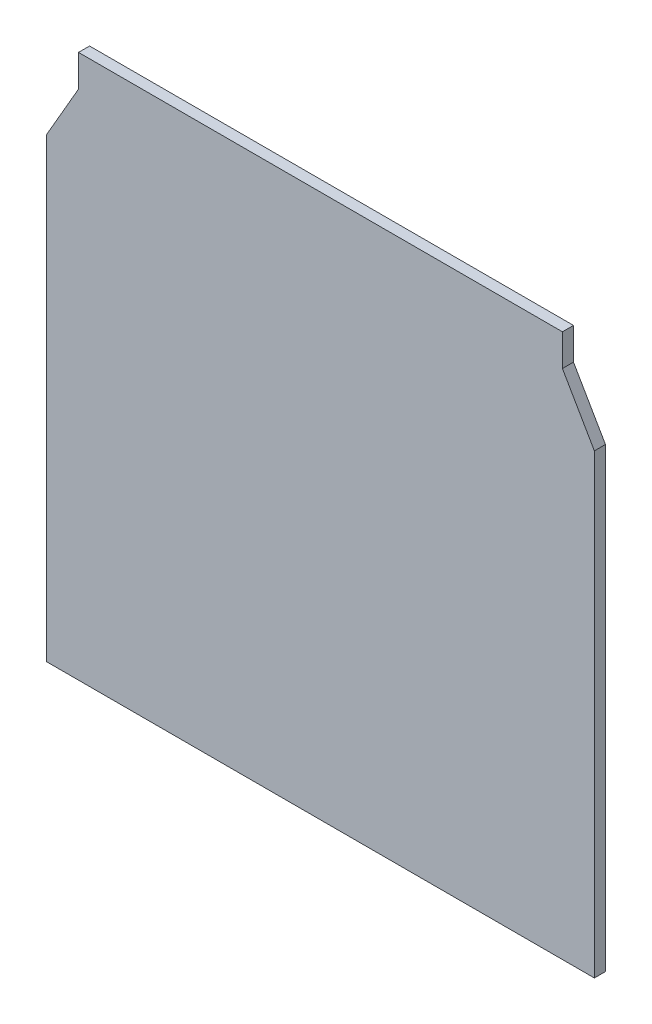
ISO-10303-21;
HEADER;
FILE_DESCRIPTION(('STEP AP214'),'2;1');
FILE_NAME('part.step','',(''),(''),'','','');
FILE_SCHEMA(('AUTOMOTIVE_DESIGN { 1 0 10303 214 1 1 1 1 }'));
ENDSEC;
DATA;
#1=APPLICATION_CONTEXT('core data for automotive mechanical design processes');
#2=APPLICATION_PROTOCOL_DEFINITION('international standard','automotive_design',2000,#1);
#3=PRODUCT_CONTEXT('',#1,'mechanical');
#4=PRODUCT('Part','Part','',(#3));
#5=PRODUCT_RELATED_PRODUCT_CATEGORY('part','',(#4));
#6=PRODUCT_DEFINITION_FORMATION('','',#4);
#7=PRODUCT_DEFINITION_CONTEXT('part definition',#1,'design');
#8=PRODUCT_DEFINITION('design','',#6,#7);
#9=PRODUCT_DEFINITION_SHAPE('','',#8);
#10=(LENGTH_UNIT() NAMED_UNIT(*) SI_UNIT(.MILLI.,.METRE.));
#11=(NAMED_UNIT(*) PLANE_ANGLE_UNIT() SI_UNIT($,.RADIAN.));
#12=(NAMED_UNIT(*) SI_UNIT($,.STERADIAN.) SOLID_ANGLE_UNIT());
#13=UNCERTAINTY_MEASURE_WITH_UNIT(LENGTH_MEASURE(1.E-05),#10,'distance_accuracy_value','');
#14=(GEOMETRIC_REPRESENTATION_CONTEXT(3) GLOBAL_UNCERTAINTY_ASSIGNED_CONTEXT((#13)) GLOBAL_UNIT_ASSIGNED_CONTEXT((#10,
#11,#12)) REPRESENTATION_CONTEXT('',''));
#15=CARTESIAN_POINT('',(0.,0.,0.));
#16=DIRECTION('',(0.,0.,1.));
#17=DIRECTION('',(1.,0.,0.));
#18=AXIS2_PLACEMENT_3D('',#15,#16,#17);
#19=CARTESIAN_POINT('',(99.,0.,4.));
#20=DIRECTION('',(-1.,0.,0.));
#21=DIRECTION('',(0.,0.,1.));
#22=AXIS2_PLACEMENT_3D('',#19,#20,#21);
#23=PLANE('',#22);
#24=DIRECTION('',(0.,1.,0.));
#25=VECTOR('',#24,1.);
#26=CARTESIAN_POINT('',(99.,0.,0.));
#27=LINE('',#26,#25);
#28=CARTESIAN_POINT('',(99.,0.,0.));
#29=VERTEX_POINT('',#28);
#30=CARTESIAN_POINT('',(99.,165.,0.));
#31=VERTEX_POINT('',#30);
#32=EDGE_CURVE('E136',#29,#31,#27,.T.);
#33=ORIENTED_EDGE('',*,*,#32,.T.);
#34=DIRECTION('',(0.,0.,-1.));
#35=VECTOR('',#34,1.);
#36=CARTESIAN_POINT('',(99.,165.,4.));
#37=LINE('',#36,#35);
#38=CARTESIAN_POINT('',(99.,165.,4.));
#39=VERTEX_POINT('',#38);
#40=EDGE_CURVE('E11',#39,#31,#37,.T.);
#41=ORIENTED_EDGE('',*,*,#40,.F.);
#42=DIRECTION('',(0.,1.,0.));
#43=VECTOR('',#42,1.);
#44=CARTESIAN_POINT('',(99.,0.,4.));
#45=LINE('',#44,#43);
#46=CARTESIAN_POINT('',(99.,0.,4.));
#47=VERTEX_POINT('',#46);
#48=EDGE_CURVE('E150',#47,#39,#45,.T.);
#49=ORIENTED_EDGE('',*,*,#48,.F.);
#50=DIRECTION('',(0.,0.,-1.));
#51=VECTOR('',#50,1.);
#52=CARTESIAN_POINT('',(99.,0.,4.));
#53=LINE('',#52,#51);
#54=EDGE_CURVE('E132',#47,#29,#53,.T.);
#55=ORIENTED_EDGE('',*,*,#54,.T.);
#56=EDGE_LOOP('',(#33,#41,#49,#55));
#57=FACE_BOUND('',#56,.T.);
#58=ADVANCED_FACE('F40',(#57),#23,.F.);
#59=CARTESIAN_POINT('',(99.,165.,4.));
#60=DIRECTION('',(-0.866025403784436,-0.500000000000004,0.));
#61=DIRECTION('',(0.500000000000004,-0.866025403784436,0.));
#62=AXIS2_PLACEMENT_3D('',#59,#60,#61);
#63=PLANE('',#62);
#64=DIRECTION('',(-0.500000000000004,0.866025403784436,0.));
#65=VECTOR('',#64,1.);
#66=CARTESIAN_POINT('',(99.,165.,0.));
#67=LINE('',#66,#65);
#68=CARTESIAN_POINT('',(87.4529946162074,185.,0.));
#69=VERTEX_POINT('',#68);
#70=EDGE_CURVE('E139',#31,#69,#67,.T.);
#71=ORIENTED_EDGE('',*,*,#70,.T.);
#72=DIRECTION('',(0.,0.,-1.));
#73=VECTOR('',#72,1.);
#74=CARTESIAN_POINT('',(87.4529946162074,185.,4.));
#75=LINE('',#74,#73);
#76=CARTESIAN_POINT('',(87.4529946162074,185.,4.));
#77=VERTEX_POINT('',#76);
#78=EDGE_CURVE('E48',#77,#69,#75,.T.);
#79=ORIENTED_EDGE('',*,*,#78,.F.);
#80=DIRECTION('',(-0.500000000000004,0.866025403784436,0.));
#81=VECTOR('',#80,1.);
#82=CARTESIAN_POINT('',(99.,165.,4.));
#83=LINE('',#82,#81);
#84=EDGE_CURVE('E99',#39,#77,#83,.T.);
#85=ORIENTED_EDGE('',*,*,#84,.F.);
#86=ORIENTED_EDGE('',*,*,#40,.T.);
#87=EDGE_LOOP('',(#71,#79,#85,#86));
#88=FACE_BOUND('',#87,.T.);
#89=ADVANCED_FACE('F185',(#88),#63,.F.);
#90=CARTESIAN_POINT('',(87.4529946162074,185.,4.));
#91=DIRECTION('',(-1.,0.,0.));
#92=DIRECTION('',(0.,-1.,0.));
#93=AXIS2_PLACEMENT_3D('',#90,#91,#92);
#94=PLANE('',#93);
#95=DIRECTION('',(0.,1.,0.));
#96=VECTOR('',#95,1.);
#97=CARTESIAN_POINT('',(87.4529946162074,185.,0.));
#98=LINE('',#97,#96);
#99=CARTESIAN_POINT('',(87.4529946162074,196.5,0.));
#100=VERTEX_POINT('',#99);
#101=EDGE_CURVE('E141',#69,#100,#98,.T.);
#102=ORIENTED_EDGE('',*,*,#101,.T.);
#103=DIRECTION('',(0.,0.,-1.));
#104=VECTOR('',#103,1.);
#105=CARTESIAN_POINT('',(87.4529946162074,196.5,4.));
#106=LINE('',#105,#104);
#107=CARTESIAN_POINT('',(87.4529946162074,196.5,4.));
#108=VERTEX_POINT('',#107);
#109=EDGE_CURVE('E157',#108,#100,#106,.T.);
#110=ORIENTED_EDGE('',*,*,#109,.F.);
#111=DIRECTION('',(0.,1.,0.));
#112=VECTOR('',#111,1.);
#113=CARTESIAN_POINT('',(87.4529946162074,185.,4.));
#114=LINE('',#113,#112);
#115=EDGE_CURVE('E165',#77,#108,#114,.T.);
#116=ORIENTED_EDGE('',*,*,#115,.F.);
#117=ORIENTED_EDGE('',*,*,#78,.T.);
#118=EDGE_LOOP('',(#102,#110,#116,#117));
#119=FACE_BOUND('',#118,.T.);
#120=ADVANCED_FACE('F163',(#119),#94,.F.);
#121=CARTESIAN_POINT('',(-87.4529946162076,196.5,4.));
#122=DIRECTION('',(0.,-1.,0.));
#123=DIRECTION('',(0.,0.,-1.));
#124=AXIS2_PLACEMENT_3D('',#121,#122,#123);
#125=PLANE('',#124);
#126=DIRECTION('',(-1.,0.,0.));
#127=VECTOR('',#126,1.);
#128=CARTESIAN_POINT('',(-87.4529946162076,196.5,0.));
#129=LINE('',#128,#127);
#130=CARTESIAN_POINT('',(-87.4529946162076,196.5,0.));
#131=VERTEX_POINT('',#130);
#132=EDGE_CURVE('E143',#100,#131,#129,.T.);
#133=ORIENTED_EDGE('',*,*,#132,.T.);
#134=DIRECTION('',(0.,0.,-1.));
#135=VECTOR('',#134,1.);
#136=CARTESIAN_POINT('',(-87.4529946162076,196.5,4.));
#137=LINE('',#136,#135);
#138=CARTESIAN_POINT('',(-87.4529946162076,196.5,4.));
#139=VERTEX_POINT('',#138);
#140=EDGE_CURVE('E154',#139,#131,#137,.T.);
#141=ORIENTED_EDGE('',*,*,#140,.F.);
#142=DIRECTION('',(-1.,0.,0.));
#143=VECTOR('',#142,1.);
#144=CARTESIAN_POINT('',(-87.4529946162076,196.5,4.));
#145=LINE('',#144,#143);
#146=EDGE_CURVE('E177',#108,#139,#145,.T.);
#147=ORIENTED_EDGE('',*,*,#146,.F.);
#148=ORIENTED_EDGE('',*,*,#109,.T.);
#149=EDGE_LOOP('',(#133,#141,#147,#148));
#150=FACE_BOUND('',#149,.T.);
#151=ADVANCED_FACE('F173',(#150),#125,.F.);
#152=CARTESIAN_POINT('',(-87.4529946162076,185.,4.));
#153=DIRECTION('',(1.,0.,0.));
#154=DIRECTION('',(0.,0.,-1.));
#155=AXIS2_PLACEMENT_3D('',#152,#153,#154);
#156=PLANE('',#155);
#157=DIRECTION('',(0.,-1.,0.));
#158=VECTOR('',#157,1.);
#159=CARTESIAN_POINT('',(-87.4529946162076,185.,0.));
#160=LINE('',#159,#158);
#161=CARTESIAN_POINT('',(-87.4529946162076,185.,0.));
#162=VERTEX_POINT('',#161);
#163=EDGE_CURVE('E145',#131,#162,#160,.T.);
#164=ORIENTED_EDGE('',*,*,#163,.T.);
#165=DIRECTION('',(0.,0.,-1.));
#166=VECTOR('',#165,1.);
#167=CARTESIAN_POINT('',(-87.4529946162076,185.,4.));
#168=LINE('',#167,#166);
#169=CARTESIAN_POINT('',(-87.4529946162076,185.,4.));
#170=VERTEX_POINT('',#169);
#171=EDGE_CURVE('E127',#170,#162,#168,.T.);
#172=ORIENTED_EDGE('',*,*,#171,.F.);
#173=DIRECTION('',(0.,-1.,0.));
#174=VECTOR('',#173,1.);
#175=CARTESIAN_POINT('',(-87.4529946162076,185.,4.));
#176=LINE('',#175,#174);
#177=EDGE_CURVE('E118',#139,#170,#176,.T.);
#178=ORIENTED_EDGE('',*,*,#177,.F.);
#179=ORIENTED_EDGE('',*,*,#140,.T.);
#180=EDGE_LOOP('',(#164,#172,#178,#179));
#181=FACE_BOUND('',#180,.T.);
#182=ADVANCED_FACE('F176',(#181),#156,.F.);
#183=CARTESIAN_POINT('',(-99.,165.,4.));
#184=DIRECTION('',(0.86602540378444,-0.499999999999998,0.));
#185=DIRECTION('',(0.499999999999998,0.86602540378444,0.));
#186=AXIS2_PLACEMENT_3D('',#183,#184,#185);
#187=PLANE('',#186);
#188=DIRECTION('',(-0.499999999999998,-0.86602540378444,0.));
#189=VECTOR('',#188,1.);
#190=CARTESIAN_POINT('',(-99.,165.,0.));
#191=LINE('',#190,#189);
#192=CARTESIAN_POINT('',(-99.,165.,0.));
#193=VERTEX_POINT('',#192);
#194=EDGE_CURVE('E126',#162,#193,#191,.T.);
#195=ORIENTED_EDGE('',*,*,#194,.T.);
#196=DIRECTION('',(0.,0.,-1.));
#197=VECTOR('',#196,1.);
#198=CARTESIAN_POINT('',(-99.,165.,4.));
#199=LINE('',#198,#197);
#200=CARTESIAN_POINT('',(-99.,165.,4.));
#201=VERTEX_POINT('',#200);
#202=EDGE_CURVE('E123',#201,#193,#199,.T.);
#203=ORIENTED_EDGE('',*,*,#202,.F.);
#204=DIRECTION('',(-0.499999999999998,-0.86602540378444,0.));
#205=VECTOR('',#204,1.);
#206=CARTESIAN_POINT('',(-99.,165.,4.));
#207=LINE('',#206,#205);
#208=EDGE_CURVE('E112',#170,#201,#207,.T.);
#209=ORIENTED_EDGE('',*,*,#208,.F.);
#210=ORIENTED_EDGE('',*,*,#171,.T.);
#211=EDGE_LOOP('',(#195,#203,#209,#210));
#212=FACE_BOUND('',#211,.T.);
#213=ADVANCED_FACE('F124',(#212),#187,.F.);
#214=CARTESIAN_POINT('',(-99.,0.,4.));
#215=DIRECTION('',(1.,0.,0.));
#216=DIRECTION('',(0.,0.,-1.));
#217=AXIS2_PLACEMENT_3D('',#214,#215,#216);
#218=PLANE('',#217);
#219=DIRECTION('',(0.,-1.,0.));
#220=VECTOR('',#219,1.);
#221=CARTESIAN_POINT('',(-99.,0.,0.));
#222=LINE('',#221,#220);
#223=CARTESIAN_POINT('',(-99.,0.,0.));
#224=VERTEX_POINT('',#223);
#225=EDGE_CURVE('E85',#193,#224,#222,.T.);
#226=ORIENTED_EDGE('',*,*,#225,.T.);
#227=DIRECTION('',(0.,0.,-1.));
#228=VECTOR('',#227,1.);
#229=CARTESIAN_POINT('',(-99.,0.,4.));
#230=LINE('',#229,#228);
#231=CARTESIAN_POINT('',(-99.,0.,4.));
#232=VERTEX_POINT('',#231);
#233=EDGE_CURVE('E128',#232,#224,#230,.T.);
#234=ORIENTED_EDGE('',*,*,#233,.F.);
#235=DIRECTION('',(0.,-1.,0.));
#236=VECTOR('',#235,1.);
#237=CARTESIAN_POINT('',(-99.,0.,4.));
#238=LINE('',#237,#236);
#239=EDGE_CURVE('E116',#201,#232,#238,.T.);
#240=ORIENTED_EDGE('',*,*,#239,.F.);
#241=ORIENTED_EDGE('',*,*,#202,.T.);
#242=EDGE_LOOP('',(#226,#234,#240,#241));
#243=FACE_BOUND('',#242,.T.);
#244=ADVANCED_FACE('F130',(#243),#218,.F.);
#245=CARTESIAN_POINT('',(-99.,0.,4.));
#246=DIRECTION('',(0.,1.,0.));
#247=DIRECTION('',(-1.,0.,0.));
#248=AXIS2_PLACEMENT_3D('',#245,#246,#247);
#249=PLANE('',#248);
#250=DIRECTION('',(1.,0.,0.));
#251=VECTOR('',#250,1.);
#252=CARTESIAN_POINT('',(-99.,0.,0.));
#253=LINE('',#252,#251);
#254=EDGE_CURVE('E91',#224,#29,#253,.T.);
#255=ORIENTED_EDGE('',*,*,#254,.T.);
#256=ORIENTED_EDGE('',*,*,#54,.F.);
#257=DIRECTION('',(1.,0.,0.));
#258=VECTOR('',#257,1.);
#259=CARTESIAN_POINT('',(-99.,0.,4.));
#260=LINE('',#259,#258);
#261=EDGE_CURVE('E56',#232,#47,#260,.T.);
#262=ORIENTED_EDGE('',*,*,#261,.F.);
#263=ORIENTED_EDGE('',*,*,#233,.T.);
#264=EDGE_LOOP('',(#255,#256,#262,#263));
#265=FACE_BOUND('',#264,.T.);
#266=ADVANCED_FACE('F201',(#265),#249,.F.);
#267=CARTESIAN_POINT('',(0.,0.,4.));
#268=DIRECTION('',(0.,0.,-1.));
#269=DIRECTION('',(-1.,0.,0.));
#270=AXIS2_PLACEMENT_3D('',#267,#268,#269);
#271=PLANE('',#270);
#272=ORIENTED_EDGE('',*,*,#48,.T.);
#273=ORIENTED_EDGE('',*,*,#84,.T.);
#274=ORIENTED_EDGE('',*,*,#115,.T.);
#275=ORIENTED_EDGE('',*,*,#146,.T.);
#276=ORIENTED_EDGE('',*,*,#177,.T.);
#277=ORIENTED_EDGE('',*,*,#208,.T.);
#278=ORIENTED_EDGE('',*,*,#239,.T.);
#279=ORIENTED_EDGE('',*,*,#261,.T.);
#280=EDGE_LOOP('',(#272,#273,#274,#275,#276,#277,#278,#279));
#281=FACE_BOUND('',#280,.T.);
#282=ADVANCED_FACE('F114',(#281),#271,.F.);
#283=CARTESIAN_POINT('',(0.,0.,0.));
#284=DIRECTION('',(0.,0.,-1.));
#285=DIRECTION('',(-1.,0.,0.));
#286=AXIS2_PLACEMENT_3D('',#283,#284,#285);
#287=PLANE('',#286);
#288=ORIENTED_EDGE('',*,*,#32,.F.);
#289=ORIENTED_EDGE('',*,*,#254,.F.);
#290=ORIENTED_EDGE('',*,*,#225,.F.);
#291=ORIENTED_EDGE('',*,*,#194,.F.);
#292=ORIENTED_EDGE('',*,*,#163,.F.);
#293=ORIENTED_EDGE('',*,*,#132,.F.);
#294=ORIENTED_EDGE('',*,*,#101,.F.);
#295=ORIENTED_EDGE('',*,*,#70,.F.);
#296=EDGE_LOOP('',(#288,#289,#290,#291,#292,#293,#294,#295));
#297=FACE_BOUND('',#296,.T.);
#298=ADVANCED_FACE('F169',(#297),#287,.T.);
#299=CLOSED_SHELL('',(#58,#89,#120,#151,#182,#213,#244,#266,#282,#298));
#300=MANIFOLD_SOLID_BREP('B2',#299);
#301=ADVANCED_BREP_SHAPE_REPRESENTATION('',(#18,#300),#14);
#302=SHAPE_DEFINITION_REPRESENTATION(#9,#301);
ENDSEC;
END-ISO-10303-21;
